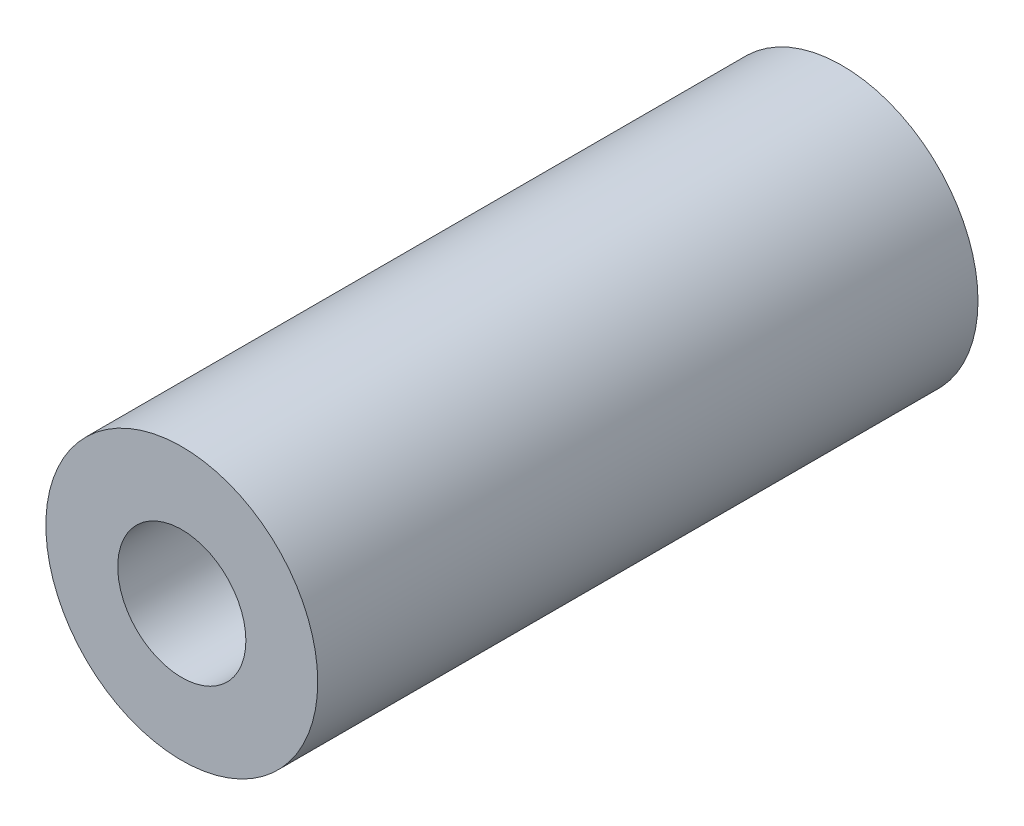
ISO-10303-21;
HEADER;
FILE_DESCRIPTION(('STEP AP214'),'2;1');
FILE_NAME('part.step','',(''),(''),'','','');
FILE_SCHEMA(('AUTOMOTIVE_DESIGN { 1 0 10303 214 1 1 1 1 }'));
ENDSEC;
DATA;
#1=APPLICATION_CONTEXT('core data for automotive mechanical design processes');
#2=APPLICATION_PROTOCOL_DEFINITION('international standard','automotive_design',2000,#1);
#3=PRODUCT_CONTEXT('',#1,'mechanical');
#4=PRODUCT('Part','Part','',(#3));
#5=PRODUCT_RELATED_PRODUCT_CATEGORY('part','',(#4));
#6=PRODUCT_DEFINITION_FORMATION('','',#4);
#7=PRODUCT_DEFINITION_CONTEXT('part definition',#1,'design');
#8=PRODUCT_DEFINITION('design','',#6,#7);
#9=PRODUCT_DEFINITION_SHAPE('','',#8);
#10=(LENGTH_UNIT() NAMED_UNIT(*) SI_UNIT(.MILLI.,.METRE.));
#11=(NAMED_UNIT(*) PLANE_ANGLE_UNIT() SI_UNIT($,.RADIAN.));
#12=(NAMED_UNIT(*) SI_UNIT($,.STERADIAN.) SOLID_ANGLE_UNIT());
#13=UNCERTAINTY_MEASURE_WITH_UNIT(LENGTH_MEASURE(1.E-05),#10,'distance_accuracy_value','');
#14=(GEOMETRIC_REPRESENTATION_CONTEXT(3) GLOBAL_UNCERTAINTY_ASSIGNED_CONTEXT((#13)) GLOBAL_UNIT_ASSIGNED_CONTEXT((#10,
#11,#12)) REPRESENTATION_CONTEXT('',''));
#15=CARTESIAN_POINT('',(0.,0.,0.));
#16=DIRECTION('',(0.,0.,1.));
#17=DIRECTION('',(1.,0.,0.));
#18=AXIS2_PLACEMENT_3D('',#15,#16,#17);
#19=CARTESIAN_POINT('',(0.,0.,34.));
#20=DIRECTION('',(0.,0.,1.));
#21=DIRECTION('',(1.,0.,0.));
#22=AXIS2_PLACEMENT_3D('',#19,#20,#21);
#23=PLANE('',#22);
#24=CARTESIAN_POINT('',(0.,0.,34.));
#25=DIRECTION('',(0.,0.,1.));
#26=DIRECTION('',(1.,0.,0.));
#27=AXIS2_PLACEMENT_3D('',#24,#25,#26);
#28=CIRCLE('',#27,7.);
#29=CARTESIAN_POINT('',(7.,0.,34.));
#30=VERTEX_POINT('',#29);
#31=EDGE_CURVE('E10',#30,#30,#28,.T.);
#32=ORIENTED_EDGE('',*,*,#31,.T.);
#33=EDGE_LOOP('',(#32));
#34=FACE_BOUND('',#33,.T.);
#35=CARTESIAN_POINT('',(0.,0.,34.));
#36=DIRECTION('',(0.,0.,1.));
#37=DIRECTION('',(1.,0.,0.));
#38=AXIS2_PLACEMENT_3D('',#35,#36,#37);
#39=CIRCLE('',#38,3.3);
#40=CARTESIAN_POINT('',(3.3,0.,34.));
#41=VERTEX_POINT('',#40);
#42=EDGE_CURVE('E48',#41,#41,#39,.T.);
#43=ORIENTED_EDGE('',*,*,#42,.F.);
#44=EDGE_LOOP('',(#43));
#45=FACE_BOUND('',#44,.T.);
#46=ADVANCED_FACE('F40',(#34,#45),#23,.T.);
#47=CARTESIAN_POINT('',(0.,0.,0.));
#48=DIRECTION('',(0.,0.,1.));
#49=DIRECTION('',(1.,0.,0.));
#50=AXIS2_PLACEMENT_3D('',#47,#48,#49);
#51=PLANE('',#50);
#52=CARTESIAN_POINT('',(0.,0.,0.));
#53=DIRECTION('',(0.,0.,1.));
#54=DIRECTION('',(1.,0.,0.));
#55=AXIS2_PLACEMENT_3D('',#52,#53,#54);
#56=CIRCLE('',#55,7.);
#57=CARTESIAN_POINT('',(7.,0.,0.));
#58=VERTEX_POINT('',#57);
#59=EDGE_CURVE('E41',#58,#58,#56,.T.);
#60=ORIENTED_EDGE('',*,*,#59,.F.);
#61=EDGE_LOOP('',(#60));
#62=FACE_BOUND('',#61,.T.);
#63=CARTESIAN_POINT('',(0.,0.,0.));
#64=DIRECTION('',(0.,0.,1.));
#65=DIRECTION('',(1.,0.,0.));
#66=AXIS2_PLACEMENT_3D('',#63,#64,#65);
#67=CIRCLE('',#66,3.3);
#68=CARTESIAN_POINT('',(3.3,0.,0.));
#69=VERTEX_POINT('',#68);
#70=EDGE_CURVE('E49',#69,#69,#67,.T.);
#71=ORIENTED_EDGE('',*,*,#70,.T.);
#72=EDGE_LOOP('',(#71));
#73=FACE_BOUND('',#72,.T.);
#74=ADVANCED_FACE('F58',(#62,#73),#51,.F.);
#75=CARTESIAN_POINT('',(0.,0.,34.));
#76=DIRECTION('',(0.,0.,-1.));
#77=DIRECTION('',(-1.,0.,0.));
#78=AXIS2_PLACEMENT_3D('',#75,#76,#77);
#79=CYLINDRICAL_SURFACE('',#78,7.);
#80=ORIENTED_EDGE('',*,*,#31,.F.);
#81=EDGE_LOOP('',(#80));
#82=FACE_BOUND('',#81,.T.);
#83=ORIENTED_EDGE('',*,*,#59,.T.);
#84=EDGE_LOOP('',(#83));
#85=FACE_BOUND('',#84,.T.);
#86=ADVANCED_FACE('F39',(#82,#85),#79,.T.);
#87=CARTESIAN_POINT('',(0.,0.,34.));
#88=DIRECTION('',(0.,0.,-1.));
#89=DIRECTION('',(-1.,0.,0.));
#90=AXIS2_PLACEMENT_3D('',#87,#88,#89);
#91=CYLINDRICAL_SURFACE('',#90,3.3);
#92=ORIENTED_EDGE('',*,*,#42,.T.);
#93=EDGE_LOOP('',(#92));
#94=FACE_BOUND('',#93,.T.);
#95=ORIENTED_EDGE('',*,*,#70,.F.);
#96=EDGE_LOOP('',(#95));
#97=FACE_BOUND('',#96,.T.);
#98=ADVANCED_FACE('F57',(#94,#97),#91,.F.);
#99=CLOSED_SHELL('',(#46,#74,#86,#98));
#100=MANIFOLD_SOLID_BREP('B2',#99);
#101=ADVANCED_BREP_SHAPE_REPRESENTATION('',(#18,#100),#14);
#102=SHAPE_DEFINITION_REPRESENTATION(#9,#101);
ENDSEC;
END-ISO-10303-21;
